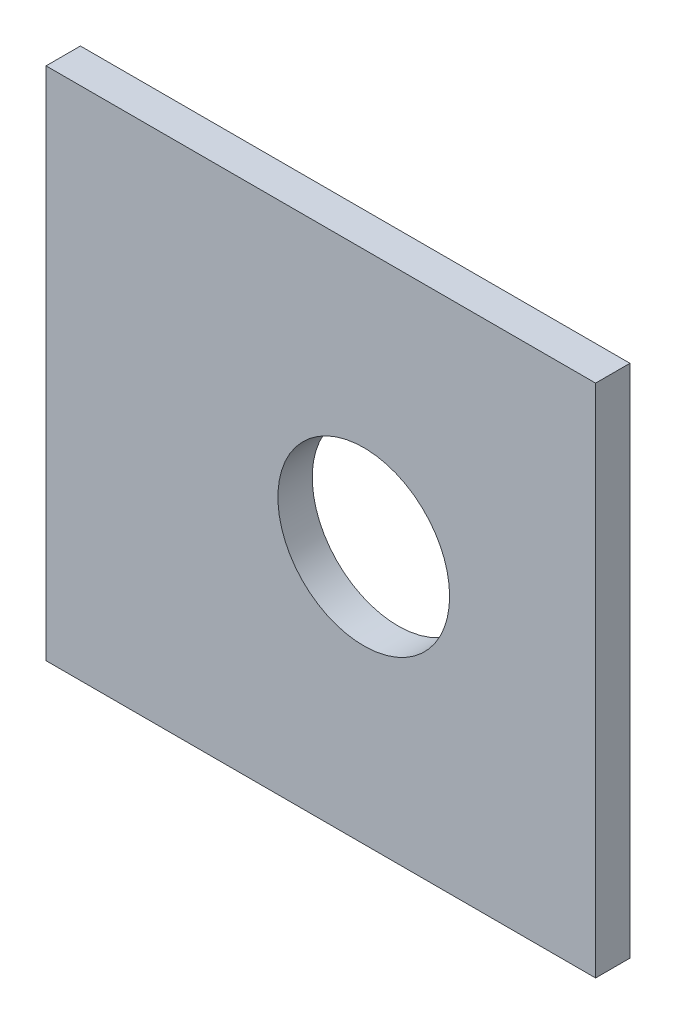
ISO-10303-21;
HEADER;
FILE_DESCRIPTION(('STEP AP214'),'2;1');
FILE_NAME('part.step','',(''),(''),'','','');
FILE_SCHEMA(('AUTOMOTIVE_DESIGN { 1 0 10303 214 1 1 1 1 }'));
ENDSEC;
DATA;
#1=APPLICATION_CONTEXT('core data for automotive mechanical design processes');
#2=APPLICATION_PROTOCOL_DEFINITION('international standard','automotive_design',2000,#1);
#3=PRODUCT_CONTEXT('',#1,'mechanical');
#4=PRODUCT('Part','Part','',(#3));
#5=PRODUCT_RELATED_PRODUCT_CATEGORY('part','',(#4));
#6=PRODUCT_DEFINITION_FORMATION('','',#4);
#7=PRODUCT_DEFINITION_CONTEXT('part definition',#1,'design');
#8=PRODUCT_DEFINITION('design','',#6,#7);
#9=PRODUCT_DEFINITION_SHAPE('','',#8);
#10=(LENGTH_UNIT() NAMED_UNIT(*) SI_UNIT(.MILLI.,.METRE.));
#11=(NAMED_UNIT(*) PLANE_ANGLE_UNIT() SI_UNIT($,.RADIAN.));
#12=(NAMED_UNIT(*) SI_UNIT($,.STERADIAN.) SOLID_ANGLE_UNIT());
#13=UNCERTAINTY_MEASURE_WITH_UNIT(LENGTH_MEASURE(1.E-05),#10,'distance_accuracy_value','');
#14=(GEOMETRIC_REPRESENTATION_CONTEXT(3) GLOBAL_UNCERTAINTY_ASSIGNED_CONTEXT((#13)) GLOBAL_UNIT_ASSIGNED_CONTEXT((#10,
#11,#12)) REPRESENTATION_CONTEXT('',''));
#15=CARTESIAN_POINT('',(0.,0.,0.));
#16=DIRECTION('',(0.,0.,1.));
#17=DIRECTION('',(1.,0.,0.));
#18=AXIS2_PLACEMENT_3D('',#15,#16,#17);
#19=CARTESIAN_POINT('',(0.,0.,4.));
#20=DIRECTION('',(0.,0.,-1.));
#21=DIRECTION('',(-1.,0.,0.));
#22=AXIS2_PLACEMENT_3D('',#19,#20,#21);
#23=PLANE('',#22);
#24=DIRECTION('',(0.,1.,0.));
#25=VECTOR('',#24,1.);
#26=CARTESIAN_POINT('',(27.,-30.,4.));
#27=LINE('',#26,#25);
#28=CARTESIAN_POINT('',(27.,-30.,4.));
#29=VERTEX_POINT('',#28);
#30=CARTESIAN_POINT('',(27.,30.,4.));
#31=VERTEX_POINT('',#30);
#32=EDGE_CURVE('E85',#29,#31,#27,.T.);
#33=ORIENTED_EDGE('',*,*,#32,.T.);
#34=DIRECTION('',(-1.,0.,0.));
#35=VECTOR('',#34,1.);
#36=CARTESIAN_POINT('',(-37.,30.,4.));
#37=LINE('',#36,#35);
#38=CARTESIAN_POINT('',(-37.,30.,4.));
#39=VERTEX_POINT('',#38);
#40=EDGE_CURVE('E80',#31,#39,#37,.T.);
#41=ORIENTED_EDGE('',*,*,#40,.T.);
#42=DIRECTION('',(0.,-1.,0.));
#43=VECTOR('',#42,1.);
#44=CARTESIAN_POINT('',(-37.,-30.,4.));
#45=LINE('',#44,#43);
#46=CARTESIAN_POINT('',(-37.,-30.,4.));
#47=VERTEX_POINT('',#46);
#48=EDGE_CURVE('E83',#39,#47,#45,.T.);
#49=ORIENTED_EDGE('',*,*,#48,.T.);
#50=DIRECTION('',(1.,0.,0.));
#51=VECTOR('',#50,1.);
#52=CARTESIAN_POINT('',(-37.,-30.,4.));
#53=LINE('',#52,#51);
#54=EDGE_CURVE('E50',#47,#29,#53,.T.);
#55=ORIENTED_EDGE('',*,*,#54,.T.);
#56=EDGE_LOOP('',(#33,#41,#49,#55));
#57=FACE_BOUND('',#56,.T.);
#58=CARTESIAN_POINT('',(0.,0.,4.));
#59=DIRECTION('',(0.,0.,1.));
#60=DIRECTION('',(1.,0.,0.));
#61=AXIS2_PLACEMENT_3D('',#58,#59,#60);
#62=CIRCLE('',#61,10.);
#63=CARTESIAN_POINT('',(10.,0.,4.));
#64=VERTEX_POINT('',#63);
#65=EDGE_CURVE('E100',#64,#64,#62,.T.);
#66=ORIENTED_EDGE('',*,*,#65,.F.);
#67=EDGE_LOOP('',(#66));
#68=FACE_BOUND('',#67,.T.);
#69=ADVANCED_FACE('F33',(#57,#68),#23,.F.);
#70=CARTESIAN_POINT('',(0.,0.,0.));
#71=DIRECTION('',(0.,0.,-1.));
#72=DIRECTION('',(-1.,0.,0.));
#73=AXIS2_PLACEMENT_3D('',#70,#71,#72);
#74=PLANE('',#73);
#75=DIRECTION('',(0.,1.,0.));
#76=VECTOR('',#75,1.);
#77=CARTESIAN_POINT('',(27.,-30.,0.));
#78=LINE('',#77,#76);
#79=CARTESIAN_POINT('',(27.,-30.,0.));
#80=VERTEX_POINT('',#79);
#81=CARTESIAN_POINT('',(27.,30.,0.));
#82=VERTEX_POINT('',#81);
#83=EDGE_CURVE('E97',#80,#82,#78,.T.);
#84=ORIENTED_EDGE('',*,*,#83,.F.);
#85=DIRECTION('',(1.,0.,0.));
#86=VECTOR('',#85,1.);
#87=CARTESIAN_POINT('',(-37.,-30.,0.));
#88=LINE('',#87,#86);
#89=CARTESIAN_POINT('',(-37.,-30.,0.));
#90=VERTEX_POINT('',#89);
#91=EDGE_CURVE('E73',#90,#80,#88,.T.);
#92=ORIENTED_EDGE('',*,*,#91,.F.);
#93=DIRECTION('',(0.,-1.,0.));
#94=VECTOR('',#93,1.);
#95=CARTESIAN_POINT('',(-37.,-30.,0.));
#96=LINE('',#95,#94);
#97=CARTESIAN_POINT('',(-37.,30.,0.));
#98=VERTEX_POINT('',#97);
#99=EDGE_CURVE('E67',#98,#90,#96,.T.);
#100=ORIENTED_EDGE('',*,*,#99,.F.);
#101=DIRECTION('',(-1.,0.,0.));
#102=VECTOR('',#101,1.);
#103=CARTESIAN_POINT('',(-37.,30.,0.));
#104=LINE('',#103,#102);
#105=EDGE_CURVE('E89',#82,#98,#104,.T.);
#106=ORIENTED_EDGE('',*,*,#105,.F.);
#107=EDGE_LOOP('',(#84,#92,#100,#106));
#108=FACE_BOUND('',#107,.T.);
#109=CARTESIAN_POINT('',(0.,0.,0.));
#110=DIRECTION('',(0.,0.,1.));
#111=DIRECTION('',(1.,0.,0.));
#112=AXIS2_PLACEMENT_3D('',#109,#110,#111);
#113=CIRCLE('',#112,10.);
#114=CARTESIAN_POINT('',(10.,0.,0.));
#115=VERTEX_POINT('',#114);
#116=EDGE_CURVE('E112',#115,#115,#113,.T.);
#117=ORIENTED_EDGE('',*,*,#116,.T.);
#118=EDGE_LOOP('',(#117));
#119=FACE_BOUND('',#118,.T.);
#120=ADVANCED_FACE('F108',(#108,#119),#74,.T.);
#121=CARTESIAN_POINT('',(27.,-30.,4.));
#122=DIRECTION('',(-1.,0.,0.));
#123=DIRECTION('',(0.,0.,1.));
#124=AXIS2_PLACEMENT_3D('',#121,#122,#123);
#125=PLANE('',#124);
#126=ORIENTED_EDGE('',*,*,#83,.T.);
#127=DIRECTION('',(0.,0.,-1.));
#128=VECTOR('',#127,1.);
#129=CARTESIAN_POINT('',(27.,30.,4.));
#130=LINE('',#129,#128);
#131=EDGE_CURVE('E11',#31,#82,#130,.T.);
#132=ORIENTED_EDGE('',*,*,#131,.F.);
#133=ORIENTED_EDGE('',*,*,#32,.F.);
#134=DIRECTION('',(0.,0.,-1.));
#135=VECTOR('',#134,1.);
#136=CARTESIAN_POINT('',(27.,-30.,4.));
#137=LINE('',#136,#135);
#138=EDGE_CURVE('E93',#29,#80,#137,.T.);
#139=ORIENTED_EDGE('',*,*,#138,.T.);
#140=EDGE_LOOP('',(#126,#132,#133,#139));
#141=FACE_BOUND('',#140,.T.);
#142=ADVANCED_FACE('F35',(#141),#125,.F.);
#143=CARTESIAN_POINT('',(-37.,30.,4.));
#144=DIRECTION('',(0.,-1.,0.));
#145=DIRECTION('',(0.,0.,-1.));
#146=AXIS2_PLACEMENT_3D('',#143,#144,#145);
#147=PLANE('',#146);
#148=ORIENTED_EDGE('',*,*,#105,.T.);
#149=DIRECTION('',(0.,0.,-1.));
#150=VECTOR('',#149,1.);
#151=CARTESIAN_POINT('',(-37.,30.,4.));
#152=LINE('',#151,#150);
#153=EDGE_CURVE('E42',#39,#98,#152,.T.);
#154=ORIENTED_EDGE('',*,*,#153,.F.);
#155=ORIENTED_EDGE('',*,*,#40,.F.);
#156=ORIENTED_EDGE('',*,*,#131,.T.);
#157=EDGE_LOOP('',(#148,#154,#155,#156));
#158=FACE_BOUND('',#157,.T.);
#159=ADVANCED_FACE('F88',(#158),#147,.F.);
#160=CARTESIAN_POINT('',(-37.,-30.,4.));
#161=DIRECTION('',(1.,0.,0.));
#162=DIRECTION('',(0.,0.,-1.));
#163=AXIS2_PLACEMENT_3D('',#160,#161,#162);
#164=PLANE('',#163);
#165=ORIENTED_EDGE('',*,*,#99,.T.);
#166=DIRECTION('',(0.,0.,-1.));
#167=VECTOR('',#166,1.);
#168=CARTESIAN_POINT('',(-37.,-30.,4.));
#169=LINE('',#168,#167);
#170=EDGE_CURVE('E90',#47,#90,#169,.T.);
#171=ORIENTED_EDGE('',*,*,#170,.F.);
#172=ORIENTED_EDGE('',*,*,#48,.F.);
#173=ORIENTED_EDGE('',*,*,#153,.T.);
#174=EDGE_LOOP('',(#165,#171,#172,#173));
#175=FACE_BOUND('',#174,.T.);
#176=ADVANCED_FACE('F91',(#175),#164,.F.);
#177=CARTESIAN_POINT('',(-37.,-30.,4.));
#178=DIRECTION('',(0.,1.,0.));
#179=DIRECTION('',(0.,0.,1.));
#180=AXIS2_PLACEMENT_3D('',#177,#178,#179);
#181=PLANE('',#180);
#182=ORIENTED_EDGE('',*,*,#91,.T.);
#183=ORIENTED_EDGE('',*,*,#138,.F.);
#184=ORIENTED_EDGE('',*,*,#54,.F.);
#185=ORIENTED_EDGE('',*,*,#170,.T.);
#186=EDGE_LOOP('',(#182,#183,#184,#185));
#187=FACE_BOUND('',#186,.T.);
#188=ADVANCED_FACE('F105',(#187),#181,.F.);
#189=CARTESIAN_POINT('',(0.,0.,4.));
#190=DIRECTION('',(0.,0.,-1.));
#191=DIRECTION('',(-1.,0.,0.));
#192=AXIS2_PLACEMENT_3D('',#189,#190,#191);
#193=CYLINDRICAL_SURFACE('',#192,10.);
#194=ORIENTED_EDGE('',*,*,#65,.T.);
#195=EDGE_LOOP('',(#194));
#196=FACE_BOUND('',#195,.T.);
#197=ORIENTED_EDGE('',*,*,#116,.F.);
#198=EDGE_LOOP('',(#197));
#199=FACE_BOUND('',#198,.T.);
#200=ADVANCED_FACE('F118',(#196,#199),#193,.F.);
#201=CLOSED_SHELL('',(#69,#120,#142,#159,#176,#188,#200));
#202=MANIFOLD_SOLID_BREP('B2',#201);
#203=ADVANCED_BREP_SHAPE_REPRESENTATION('',(#18,#202),#14);
#204=SHAPE_DEFINITION_REPRESENTATION(#9,#203);
ENDSEC;
END-ISO-10303-21;
